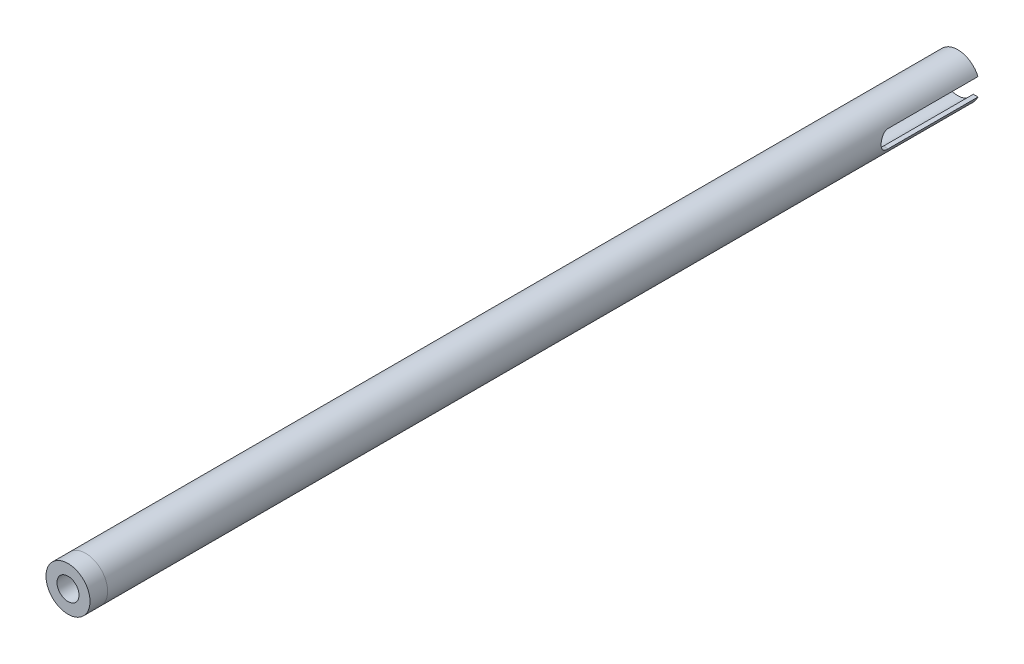
ISO-10303-21;
HEADER;
FILE_DESCRIPTION(('STEP AP214'),'2;1');
FILE_NAME('part.step','',(''),(''),'','','');
FILE_SCHEMA(('AUTOMOTIVE_DESIGN { 1 0 10303 214 1 1 1 1 }'));
ENDSEC;
DATA;
#1=APPLICATION_CONTEXT('core data for automotive mechanical design processes');
#2=APPLICATION_PROTOCOL_DEFINITION('international standard','automotive_design',2000,#1);
#3=PRODUCT_CONTEXT('',#1,'mechanical');
#4=PRODUCT('Part','Part','',(#3));
#5=PRODUCT_RELATED_PRODUCT_CATEGORY('part','',(#4));
#6=PRODUCT_DEFINITION_FORMATION('','',#4);
#7=PRODUCT_DEFINITION_CONTEXT('part definition',#1,'design');
#8=PRODUCT_DEFINITION('design','',#6,#7);
#9=PRODUCT_DEFINITION_SHAPE('','',#8);
#10=(LENGTH_UNIT() NAMED_UNIT(*) SI_UNIT(.MILLI.,.METRE.));
#11=(NAMED_UNIT(*) PLANE_ANGLE_UNIT() SI_UNIT($,.RADIAN.));
#12=(NAMED_UNIT(*) SI_UNIT($,.STERADIAN.) SOLID_ANGLE_UNIT());
#13=UNCERTAINTY_MEASURE_WITH_UNIT(LENGTH_MEASURE(1.E-05),#10,'distance_accuracy_value','');
#14=(GEOMETRIC_REPRESENTATION_CONTEXT(3) GLOBAL_UNCERTAINTY_ASSIGNED_CONTEXT((#13)) GLOBAL_UNIT_ASSIGNED_CONTEXT((#10,
#11,#12)) REPRESENTATION_CONTEXT('',''));
#15=CARTESIAN_POINT('',(0.,0.,0.));
#16=DIRECTION('',(0.,0.,1.));
#17=DIRECTION('',(1.,0.,0.));
#18=AXIS2_PLACEMENT_3D('',#15,#16,#17);
#19=CARTESIAN_POINT('',(0.,0.,-320.609127033779));
#20=DIRECTION('',(0.,0.,1.));
#21=DIRECTION('',(1.,0.,0.));
#22=AXIS2_PLACEMENT_3D('',#19,#20,#21);
#23=CYLINDRICAL_SURFACE('',#22,7.9375);
#24=CARTESIAN_POINT('',(0.,0.,-6.35));
#25=DIRECTION('',(0.,0.,1.));
#26=DIRECTION('',(1.,0.,0.));
#27=AXIS2_PLACEMENT_3D('',#24,#25,#26);
#28=CIRCLE('',#27,7.9375);
#29=CARTESIAN_POINT('',(7.9375,0.,-6.35));
#30=VERTEX_POINT('',#29);
#31=EDGE_CURVE('E167',#30,#30,#28,.T.);
#32=ORIENTED_EDGE('',*,*,#31,.F.);
#33=EDGE_LOOP('',(#32));
#34=FACE_BOUND('',#33,.T.);
#35=CARTESIAN_POINT('',(-7.2748389157424,3.175,-288.224127033779));
#36=CARTESIAN_POINT('',(-7.27482137043434,3.17501267173453,-288.138706918296));
#37=CARTESIAN_POINT('',(-7.27634297592672,3.17155313247793,-288.053296388733));
#38=CARTESIAN_POINT('',(-7.28233338484875,3.15778866907725,-287.883164384405));
#39=CARTESIAN_POINT('',(-7.28680106535325,3.14748635311323,-287.798442659546));
#40=CARTESIAN_POINT('',(-7.2985291631267,3.12019002880163,-287.630628959738));
#41=CARTESIAN_POINT('',(-7.30577831906487,3.10322299732752,-287.547531814978));
#42=CARTESIAN_POINT('',(-7.32282161153744,3.06278779397035,-287.383220712953));
#43=CARTESIAN_POINT('',(-7.33261590324725,3.03931922568674,-287.30200687084));
#44=CARTESIAN_POINT('',(-7.36535331460444,2.95952924342962,-287.062182048257));
#45=CARTESIAN_POINT('',(-7.39167595677839,2.89376893609239,-286.907057119453));
#46=CARTESIAN_POINT('',(-7.45033259991547,2.73920602658923,-286.609969692742));
#47=CARTESIAN_POINT('',(-7.48267254395243,2.65038060922872,-286.468020417524));
#48=CARTESIAN_POINT('',(-7.55175295441387,2.44684429809694,-286.193299648004));
#49=CARTESIAN_POINT('',(-7.58863404630155,2.33103943595687,-286.061372263493));
#50=CARTESIAN_POINT('',(-7.66147718953598,2.07914562663533,-285.818209379861));
#51=CARTESIAN_POINT('',(-7.69743902899202,1.94305205135846,-285.706978614933));
#52=CARTESIAN_POINT('',(-7.76611692840651,1.6477828266442,-285.504057415438));
#53=CARTESIAN_POINT('',(-7.79864638434712,1.48790317306358,-285.413323004034));
#54=CARTESIAN_POINT('',(-7.85502980346525,1.15369615984566,-285.260465450617));
#55=CARTESIAN_POINT('',(-7.87889360585224,0.97938546360275,-285.198309837999));
#56=CARTESIAN_POINT('',(-7.91022225039827,0.670405323433378,-285.117798194343));
#57=CARTESIAN_POINT('',(-7.92038443902171,0.537888188660459,-285.092120270933));
#58=CARTESIAN_POINT('',(-7.93061686811602,0.337231082382121,-285.066365187852));
#59=CARTESIAN_POINT('',(-7.93319257341971,0.26999164718031,-285.059907090571));
#60=CARTESIAN_POINT('',(-7.93663621925193,0.135173873369604,-285.05128607282));
#61=CARTESIAN_POINT('',(-7.93750363389236,0.0675954368175925,-285.049124475001));
#62=CARTESIAN_POINT('',(-7.9375,0.,-285.049127033779));
#63=B_SPLINE_CURVE_WITH_KNOTS('',3,(#35,#36,#37,#38,#39,#40,#41,#42,#43,#44,#45,#46,#47,#48,#49,
#50,#51,#52,#53,#54,#55,#56,#57,#58,#59,#60,#61,#62),.UNSPECIFIED.,.F.,.F.,(4,2,2,2,2,2,2,2,2,2,
2,2,2,4),(0.,0.256160797396612,0.512224013007058,0.767261264672238,1.02231406945471,
1.53142416248594,2.04103978047897,2.57679273649405,3.11266809162683,3.6699113602974,
4.22651992730642,4.63134321412665,4.83399375866619,5.03670667834028),.UNSPECIFIED.);
#64=CARTESIAN_POINT('',(-7.2748389157424,3.175,-288.224127033779));
#65=VERTEX_POINT('',#64);
#66=CARTESIAN_POINT('',(-7.9375,0.,-285.049127033779));
#67=VERTEX_POINT('',#66);
#68=EDGE_CURVE('E194',#65,#67,#63,.T.);
#69=ORIENTED_EDGE('',*,*,#68,.T.);
#70=CARTESIAN_POINT('',(-7.9375,0.,-285.049127033779));
#71=CARTESIAN_POINT('',(-7.93751279435796,-0.0856973243893185,-285.049115003609));
#72=CARTESIAN_POINT('',(-7.93611246860092,-0.171386675169292,-285.052596371082));
#73=CARTESIAN_POINT('',(-7.93058107051394,-0.342092796869088,-285.066452466416));
#74=CARTESIAN_POINT('',(-7.92645080745519,-0.427109759557718,-285.076825151399));
#75=CARTESIAN_POINT('',(-7.91557399086504,-0.59557069094832,-285.104322345467));
#76=CARTESIAN_POINT('',(-7.90883664469869,-0.679019123580011,-285.12142309674));
#77=CARTESIAN_POINT('',(-7.89293284658536,-0.844038966454646,-285.162190344213));
#78=CARTESIAN_POINT('',(-7.88376629739099,-0.925610301410304,-285.18585710327));
#79=CARTESIAN_POINT('',(-7.85297007832481,-1.16656173687588,-285.266364758968));
#80=CARTESIAN_POINT('',(-7.82802544143958,-1.32244720282989,-285.332757391846));
#81=CARTESIAN_POINT('',(-7.77174407779742,-1.62081902572888,-285.488802795839));
#82=CARTESIAN_POINT('',(-7.74040257287306,-1.7632952496653,-285.578472967902));
#83=CARTESIAN_POINT('',(-7.67287736621953,-2.03755465224644,-285.782926575417));
#84=CARTESIAN_POINT('',(-7.63654472176443,-2.16862853615059,-285.898613432148));
#85=CARTESIAN_POINT('',(-7.56380976030912,-2.4101102261282,-286.149907533858));
#86=CARTESIAN_POINT('',(-7.52740741976911,-2.52050895891189,-286.28552347834));
#87=CARTESIAN_POINT('',(-7.45683282624283,-2.72240939900243,-286.580221973206));
#88=CARTESIAN_POINT('',(-7.4228346735038,-2.81283701743189,-286.740085963122));
#89=CARTESIAN_POINT('',(-7.3633362219632,-2.96511894168387,-287.074211927918));
#90=CARTESIAN_POINT('',(-7.33782422493328,-3.02701262758154,-287.248453665677));
#91=CARTESIAN_POINT('',(-7.30424985403508,-3.10695047193342,-287.556757390328));
#92=CARTESIAN_POINT('',(-7.29331360019113,-3.13238569878909,-287.688616151214));
#93=CARTESIAN_POINT('',(-7.28227977674291,-3.15790858319001,-287.888333032908));
#94=CARTESIAN_POINT('',(-7.27949685702346,-3.16431127275807,-287.955281323668));
#95=CARTESIAN_POINT('',(-7.27577355567174,-3.17285909036155,-288.089522881534));
#96=CARTESIAN_POINT('',(-7.27483380475762,-3.1750027609968,-288.156816258832));
#97=CARTESIAN_POINT('',(-7.2748389157424,-3.175,-288.224127033779));
#98=B_SPLINE_CURVE_WITH_KNOTS('',3,(#70,#71,#72,#73,#74,#75,#76,#77,#78,#79,#80,#81,#82,#83,#84,
#85,#86,#87,#88,#89,#90,#91,#92,#93,#94,#95,#96,#97),.UNSPECIFIED.,.F.,.F.,(4,2,2,2,2,2,2,2,2,2,
2,2,2,4),(0.,0.256996432008007,0.513916713336979,0.769937797705388,1.02596913282157,
1.53722547809954,2.04886511530059,2.58219314099272,3.115754672018,3.67332953074262,
4.2301325519037,4.63306130520182,4.83485003827446,5.03670780985613),.UNSPECIFIED.);
#99=CARTESIAN_POINT('',(-7.2748389157424,-3.175,-288.224127033779));
#100=VERTEX_POINT('',#99);
#101=EDGE_CURVE('E146',#67,#100,#98,.T.);
#102=ORIENTED_EDGE('',*,*,#101,.T.);
#103=DIRECTION('',(0.,0.,-1.));
#104=VECTOR('',#103,1.);
#105=CARTESIAN_POINT('',(-7.2748389157424,-3.175,-285.049127033779));
#106=LINE('',#105,#104);
#107=CARTESIAN_POINT('',(-7.2748389157424,-3.175,-320.609127033779));
#108=VERTEX_POINT('',#107);
#109=EDGE_CURVE('E141',#100,#108,#106,.T.);
#110=ORIENTED_EDGE('',*,*,#109,.T.);
#111=CARTESIAN_POINT('',(0.,0.,-320.609127033779));
#112=DIRECTION('',(0.,0.,1.));
#113=DIRECTION('',(1.,0.,0.));
#114=AXIS2_PLACEMENT_3D('',#111,#112,#113);
#115=CIRCLE('',#114,7.9375);
#116=CARTESIAN_POINT('',(7.2748389157424,-3.175,-320.609127033779));
#117=VERTEX_POINT('',#116);
#118=EDGE_CURVE('E144',#108,#117,#115,.T.);
#119=ORIENTED_EDGE('',*,*,#118,.T.);
#120=DIRECTION('',(0.,0.,-1.));
#121=VECTOR('',#120,1.);
#122=CARTESIAN_POINT('',(7.2748389157424,-3.175,-285.049127033779));
#123=LINE('',#122,#121);
#124=CARTESIAN_POINT('',(7.2748389157424,-3.175,-288.224127033779));
#125=VERTEX_POINT('',#124);
#126=EDGE_CURVE('E427',#125,#117,#123,.T.);
#127=ORIENTED_EDGE('',*,*,#126,.F.);
#128=CARTESIAN_POINT('',(7.2748389157424,-3.175,-288.224127033779));
#129=CARTESIAN_POINT('',(7.27482137043434,-3.17501267173453,-288.138706918296));
#130=CARTESIAN_POINT('',(7.27634297592672,-3.17155313247793,-288.053296388733));
#131=CARTESIAN_POINT('',(7.28233338484875,-3.15778866907725,-287.883164384405));
#132=CARTESIAN_POINT('',(7.28680106535325,-3.14748635311323,-287.798442659546));
#133=CARTESIAN_POINT('',(7.2985291631267,-3.12019002880163,-287.630628959738));
#134=CARTESIAN_POINT('',(7.30577831906487,-3.10322299732752,-287.547531814978));
#135=CARTESIAN_POINT('',(7.32282161153744,-3.06278779397035,-287.383220712953));
#136=CARTESIAN_POINT('',(7.33261590324725,-3.03931922568674,-287.30200687084));
#137=CARTESIAN_POINT('',(7.36535331460444,-2.95952924342962,-287.062182048257));
#138=CARTESIAN_POINT('',(7.39167595677839,-2.89376893609239,-286.907057119453));
#139=CARTESIAN_POINT('',(7.45033259991547,-2.73920602658923,-286.609969692742));
#140=CARTESIAN_POINT('',(7.48267254395243,-2.65038060922872,-286.468020417524));
#141=CARTESIAN_POINT('',(7.55175295441387,-2.44684429809694,-286.193299648004));
#142=CARTESIAN_POINT('',(7.58863404630155,-2.33103943595687,-286.061372263493));
#143=CARTESIAN_POINT('',(7.66147718953598,-2.07914562663533,-285.818209379861));
#144=CARTESIAN_POINT('',(7.69743902899202,-1.94305205135846,-285.706978614933));
#145=CARTESIAN_POINT('',(7.76611692840651,-1.6477828266442,-285.504057415438));
#146=CARTESIAN_POINT('',(7.79864638434712,-1.48790317306358,-285.413323004034));
#147=CARTESIAN_POINT('',(7.85502980346525,-1.15369615984566,-285.260465450617));
#148=CARTESIAN_POINT('',(7.87889360585224,-0.97938546360275,-285.198309837999));
#149=CARTESIAN_POINT('',(7.91022225039827,-0.670405323433378,-285.117798194343));
#150=CARTESIAN_POINT('',(7.92038443902171,-0.537888188660459,-285.092120270933));
#151=CARTESIAN_POINT('',(7.93061686811602,-0.337231082382121,-285.066365187852));
#152=CARTESIAN_POINT('',(7.93319257341971,-0.26999164718031,-285.059907090571));
#153=CARTESIAN_POINT('',(7.93663621925193,-0.135173873369604,-285.05128607282));
#154=CARTESIAN_POINT('',(7.93750363389236,-0.0675954368175925,-285.049124475001));
#155=CARTESIAN_POINT('',(7.9375,0.,-285.049127033779));
#156=B_SPLINE_CURVE_WITH_KNOTS('',3,(#128,#129,#130,#131,#132,#133,#134,#135,#136,#137,#138,
#139,#140,#141,#142,#143,#144,#145,#146,#147,#148,#149,#150,#151,#152,#153,#154,#155),
.UNSPECIFIED.,.F.,.F.,(4,2,2,2,2,2,2,2,2,2,2,2,2,4),(0.,0.256160797396612,0.512224013007058,
0.767261264672238,1.02231406945471,1.53142416248594,2.04103978047897,2.57679273649405,
3.11266809162683,3.6699113602974,4.22651992730642,4.63134321412665,4.83399375866619,
5.03670667834028),.UNSPECIFIED.);
#157=CARTESIAN_POINT('',(7.9375,0.,-285.049127033779));
#158=VERTEX_POINT('',#157);
#159=EDGE_CURVE('E87',#125,#158,#156,.T.);
#160=ORIENTED_EDGE('',*,*,#159,.T.);
#161=CARTESIAN_POINT('',(7.9375,0.,-285.049127033779));
#162=CARTESIAN_POINT('',(7.93751279435796,0.0856973243893185,-285.049115003609));
#163=CARTESIAN_POINT('',(7.93611246860092,0.171386675169292,-285.052596371082));
#164=CARTESIAN_POINT('',(7.93058107051394,0.342092796869088,-285.066452466416));
#165=CARTESIAN_POINT('',(7.92645080745519,0.427109759557718,-285.076825151399));
#166=CARTESIAN_POINT('',(7.91557399086504,0.59557069094832,-285.104322345467));
#167=CARTESIAN_POINT('',(7.90883664469869,0.679019123580011,-285.12142309674));
#168=CARTESIAN_POINT('',(7.89293284658536,0.844038966454646,-285.162190344213));
#169=CARTESIAN_POINT('',(7.88376629739099,0.925610301410304,-285.18585710327));
#170=CARTESIAN_POINT('',(7.85297007832481,1.16656173687588,-285.266364758968));
#171=CARTESIAN_POINT('',(7.82802544143958,1.32244720282989,-285.332757391846));
#172=CARTESIAN_POINT('',(7.77174407779742,1.62081902572888,-285.488802795839));
#173=CARTESIAN_POINT('',(7.74040257287306,1.7632952496653,-285.578472967902));
#174=CARTESIAN_POINT('',(7.67287736621953,2.03755465224644,-285.782926575417));
#175=CARTESIAN_POINT('',(7.63654472176443,2.16862853615059,-285.898613432148));
#176=CARTESIAN_POINT('',(7.56380976030912,2.4101102261282,-286.149907533858));
#177=CARTESIAN_POINT('',(7.52740741976911,2.52050895891189,-286.28552347834));
#178=CARTESIAN_POINT('',(7.45683282624283,2.72240939900243,-286.580221973206));
#179=CARTESIAN_POINT('',(7.4228346735038,2.81283701743189,-286.740085963122));
#180=CARTESIAN_POINT('',(7.3633362219632,2.96511894168387,-287.074211927918));
#181=CARTESIAN_POINT('',(7.33782422493328,3.02701262758154,-287.248453665677));
#182=CARTESIAN_POINT('',(7.30424985403508,3.10695047193342,-287.556757390328));
#183=CARTESIAN_POINT('',(7.29331360019113,3.13238569878909,-287.688616151214));
#184=CARTESIAN_POINT('',(7.28227977674291,3.15790858319001,-287.888333032908));
#185=CARTESIAN_POINT('',(7.27949685702346,3.16431127275807,-287.955281323668));
#186=CARTESIAN_POINT('',(7.27577355567174,3.17285909036155,-288.089522881534));
#187=CARTESIAN_POINT('',(7.27483380475762,3.1750027609968,-288.156816258832));
#188=CARTESIAN_POINT('',(7.2748389157424,3.175,-288.224127033779));
#189=B_SPLINE_CURVE_WITH_KNOTS('',3,(#161,#162,#163,#164,#165,#166,#167,#168,#169,#170,#171,
#172,#173,#174,#175,#176,#177,#178,#179,#180,#181,#182,#183,#184,#185,#186,#187,#188),
.UNSPECIFIED.,.F.,.F.,(4,2,2,2,2,2,2,2,2,2,2,2,2,4),(0.,0.256996432008007,0.513916713336979,
0.769937797705388,1.02596913282157,1.53722547809954,2.04886511530059,2.58219314099272,
3.115754672018,3.67332953074262,4.2301325519037,4.63306130520182,4.83485003827446,
5.03670780985613),.UNSPECIFIED.);
#190=CARTESIAN_POINT('',(7.2748389157424,3.175,-288.224127033779));
#191=VERTEX_POINT('',#190);
#192=EDGE_CURVE('E73',#158,#191,#189,.T.);
#193=ORIENTED_EDGE('',*,*,#192,.T.);
#194=DIRECTION('',(0.,0.,-1.));
#195=VECTOR('',#194,1.);
#196=CARTESIAN_POINT('',(7.2748389157424,3.175,-285.049127033779));
#197=LINE('',#196,#195);
#198=CARTESIAN_POINT('',(7.2748389157424,3.175,-320.609127033779));
#199=VERTEX_POINT('',#198);
#200=EDGE_CURVE('E160',#191,#199,#197,.T.);
#201=ORIENTED_EDGE('',*,*,#200,.T.);
#202=CARTESIAN_POINT('',(-7.2748389157424,3.175,-320.609127033779));
#203=VERTEX_POINT('',#202);
#204=EDGE_CURVE('E166',#199,#203,#115,.T.);
#205=ORIENTED_EDGE('',*,*,#204,.T.);
#206=DIRECTION('',(0.,0.,-1.));
#207=VECTOR('',#206,1.);
#208=CARTESIAN_POINT('',(-7.2748389157424,3.175,-285.049127033779));
#209=LINE('',#208,#207);
#210=EDGE_CURVE('E420',#65,#203,#209,.T.);
#211=ORIENTED_EDGE('',*,*,#210,.F.);
#212=EDGE_LOOP('',(#69,#102,#110,#119,#127,#160,#193,#201,#205,#211));
#213=FACE_BOUND('',#212,.T.);
#214=ADVANCED_FACE('F63',(#34,#213),#23,.T.);
#215=CARTESIAN_POINT('',(0.,0.,-320.609127033779));
#216=DIRECTION('',(0.,0.,1.));
#217=DIRECTION('',(1.,0.,0.));
#218=AXIS2_PLACEMENT_3D('',#215,#216,#217);
#219=PLANE('',#218);
#220=DIRECTION('',(1.,0.,0.));
#221=VECTOR('',#220,1.);
#222=CARTESIAN_POINT('',(0.,-3.175,-320.609127033779));
#223=LINE('',#222,#221);
#224=CARTESIAN_POINT('',(-5.57246419907746,-3.175,-320.609127033779));
#225=VERTEX_POINT('',#224);
#226=EDGE_CURVE('E153',#108,#225,#223,.T.);
#227=ORIENTED_EDGE('',*,*,#226,.T.);
#228=CARTESIAN_POINT('',(0.,0.,-320.609127033779));
#229=DIRECTION('',(0.,0.,1.));
#230=DIRECTION('',(1.,0.,0.));
#231=AXIS2_PLACEMENT_3D('',#228,#229,#230);
#232=CIRCLE('',#231,6.4135);
#233=CARTESIAN_POINT('',(5.57246419907746,-3.175,-320.609127033779));
#234=VERTEX_POINT('',#233);
#235=EDGE_CURVE('E275',#225,#234,#232,.T.);
#236=ORIENTED_EDGE('',*,*,#235,.T.);
#237=DIRECTION('',(1.,0.,0.));
#238=VECTOR('',#237,1.);
#239=CARTESIAN_POINT('',(0.,-3.175,-320.609127033779));
#240=LINE('',#239,#238);
#241=EDGE_CURVE('E165',#234,#117,#240,.T.);
#242=ORIENTED_EDGE('',*,*,#241,.T.);
#243=ORIENTED_EDGE('',*,*,#118,.F.);
#244=EDGE_LOOP('',(#227,#236,#242,#243));
#245=FACE_BOUND('',#244,.T.);
#246=ADVANCED_FACE('F163',(#245),#219,.F.);
#247=CARTESIAN_POINT('',(0.,0.,-320.609127033779));
#248=DIRECTION('',(0.,0.,1.));
#249=DIRECTION('',(1.,0.,0.));
#250=AXIS2_PLACEMENT_3D('',#247,#248,#249);
#251=CYLINDRICAL_SURFACE('',#250,6.4135);
#252=CARTESIAN_POINT('',(0.,0.,-6.35));
#253=DIRECTION('',(0.,0.,1.));
#254=DIRECTION('',(1.,0.,0.));
#255=AXIS2_PLACEMENT_3D('',#252,#253,#254);
#256=CIRCLE('',#255,6.4135);
#257=CARTESIAN_POINT('',(6.4135,0.,-6.35));
#258=VERTEX_POINT('',#257);
#259=EDGE_CURVE('E149',#258,#258,#256,.T.);
#260=ORIENTED_EDGE('',*,*,#259,.T.);
#261=EDGE_LOOP('',(#260));
#262=FACE_BOUND('',#261,.T.);
#263=DIRECTION('',(0.,0.,-1.));
#264=VECTOR('',#263,1.);
#265=CARTESIAN_POINT('',(-5.57246419907746,-3.175,-285.049127033779));
#266=LINE('',#265,#264);
#267=CARTESIAN_POINT('',(-5.57246419907746,-3.175,-288.224127033779));
#268=VERTEX_POINT('',#267);
#269=EDGE_CURVE('E150',#268,#225,#266,.T.);
#270=ORIENTED_EDGE('',*,*,#269,.F.);
#271=CARTESIAN_POINT('',(-5.57246419907746,-3.175,-288.224127033779));
#272=CARTESIAN_POINT('',(-5.57244013006406,-3.17501485930532,-288.14084792074));
#273=CARTESIAN_POINT('',(-5.57433046393328,-3.17172393593588,-288.057582153869));
#274=CARTESIAN_POINT('',(-5.58175879139227,-3.15864741746939,-287.891774569058));
#275=CARTESIAN_POINT('',(-5.58729459414878,-3.14886572313217,-287.809232346457));
#276=CARTESIAN_POINT('',(-5.60179156831921,-3.12299843383606,-287.645935539727));
#277=CARTESIAN_POINT('',(-5.61073298145,-3.10694918790096,-287.565173434814));
#278=CARTESIAN_POINT('',(-5.63171276239417,-3.06875665913499,-287.405529519313));
#279=CARTESIAN_POINT('',(-5.64375147558632,-3.04661269666535,-287.326647919493));
#280=CARTESIAN_POINT('',(-5.6838799338154,-2.97148657354666,-287.093914744494));
#281=CARTESIAN_POINT('',(-5.71602843451584,-2.90973243042152,-286.943494247255));
#282=CARTESIAN_POINT('',(-5.78746445334561,-2.76491119647661,-286.655037030427));
#283=CARTESIAN_POINT('',(-5.8267630725243,-2.68181088046089,-286.517020073061));
#284=CARTESIAN_POINT('',(-5.91189137020973,-2.4888741873712,-286.245222989033));
#285=CARTESIAN_POINT('',(-5.95799203211625,-2.3774302216902,-286.112666186582));
#286=CARTESIAN_POINT('',(-6.04933625068997,-2.13433179626953,-285.867198517509));
#287=CARTESIAN_POINT('',(-6.09457954365871,-2.00267122837299,-285.754293610496));
#288=CARTESIAN_POINT('',(-6.18270630442022,-1.71220053093684,-285.543974318044));
#289=CARTESIAN_POINT('',(-6.22523407848511,-1.55216870534977,-285.448084567613));
#290=CARTESIAN_POINT('',(-6.29953728626817,-1.21586879246634,-285.285235671295));
#291=CARTESIAN_POINT('',(-6.33132906884323,-1.03962591706378,-285.218232493253));
#292=CARTESIAN_POINT('',(-6.37455801221378,-0.719418942476262,-285.128360660922));
#293=CARTESIAN_POINT('',(-6.38903678436651,-0.577736145507969,-285.098787946558));
#294=CARTESIAN_POINT('',(-6.40364692368403,-0.362616983152046,-285.069066872243));
#295=CARTESIAN_POINT('',(-6.40733246196224,-0.290370591494084,-285.061599359606));
#296=CARTESIAN_POINT('',(-6.41226237468065,-0.145424356491909,-285.051626470668));
#297=CARTESIAN_POINT('',(-6.41350576158006,-0.0727243416303731,-285.04912310173));
#298=CARTESIAN_POINT('',(-6.4135,0.,-285.049127033779));
#299=B_SPLINE_CURVE_WITH_KNOTS('',3,(#271,#272,#273,#274,#275,#276,#277,#278,#279,#280,#281,
#282,#283,#284,#285,#286,#287,#288,#289,#290,#291,#292,#293,#294,#295,#296,#297,#298),
.UNSPECIFIED.,.F.,.F.,(4,2,2,2,2,2,2,2,2,2,2,2,2,4),(0.,0.249729002226608,0.499308060527526,
0.747460667546715,0.995640957972498,1.49055300136654,1.98624009021394,2.5216022790879,
3.05712653941517,3.62817923327588,4.198358360085,4.63305000595097,4.85103401853338,
5.06910615989468),.UNSPECIFIED.);
#300=CARTESIAN_POINT('',(-6.4135,0.,-285.049127033779));
#301=VERTEX_POINT('',#300);
#302=EDGE_CURVE('E221',#268,#301,#299,.T.);
#303=ORIENTED_EDGE('',*,*,#302,.T.);
#304=CARTESIAN_POINT('',(-6.4135,0.,-285.049127033779));
#305=CARTESIAN_POINT('',(-6.41351478956105,0.0839162873638196,-285.049113633882));
#306=CARTESIAN_POINT('',(-6.41185341043851,0.167823114288182,-285.05245355993));
#307=CARTESIAN_POINT('',(-6.40528923860734,0.33495253632637,-285.065736000534));
#308=CARTESIAN_POINT('',(-6.40038773102953,0.418175389480092,-285.075675897355));
#309=CARTESIAN_POINT('',(-6.38748331817869,0.58296549878522,-285.101994701873));
#310=CARTESIAN_POINT('',(-6.37949454331383,0.664538541389253,-285.118344277361));
#311=CARTESIAN_POINT('',(-6.36062930478242,0.825821595252368,-285.157282580955));
#312=CARTESIAN_POINT('',(-6.34975266552956,0.905531492908811,-285.179871688436));
#313=CARTESIAN_POINT('',(-6.31319792977548,1.14087800407252,-285.256608251195));
#314=CARTESIAN_POINT('',(-6.28356695572383,1.29306927815055,-285.319779899384));
#315=CARTESIAN_POINT('',(-6.21648032622801,1.58455945770353,-285.467930641363));
#316=CARTESIAN_POINT('',(-6.17901685649499,1.72384528592309,-285.552931533143));
#317=CARTESIAN_POINT('',(-6.09713913910647,1.99475482128856,-285.748031671394));
#318=CARTESIAN_POINT('',(-6.05244508581476,2.12544046453043,-285.859316548133));
#319=CARTESIAN_POINT('',(-5.96206469267669,2.36716277188881,-286.101285994298));
#320=CARTESIAN_POINT('',(-5.9163776032387,2.47818397002904,-286.231985686137));
#321=CARTESIAN_POINT('',(-5.82517699615972,2.68591268931947,-286.521031515089));
#322=CARTESIAN_POINT('',(-5.77994318763785,2.78087960507694,-286.68072670967));
#323=CARTESIAN_POINT('',(-5.69959190124919,2.9420744279085,-287.016109986851));
#324=CARTESIAN_POINT('',(-5.66445328320705,3.00836254036259,-287.191763620023));
#325=CARTESIAN_POINT('',(-5.61637168534323,3.09697219420915,-287.510214994417));
#326=CARTESIAN_POINT('',(-5.60011055849822,3.1260622343607,-287.650629597076));
#327=CARTESIAN_POINT('',(-5.58363385282995,3.15533369889112,-287.864006475319));
#328=CARTESIAN_POINT('',(-5.57946041232981,3.16269716900745,-287.935738200201));
#329=CARTESIAN_POINT('',(-5.57386984218861,3.17253394278506,-288.079680140243));
#330=CARTESIAN_POINT('',(-5.57245416126573,3.17500467618403,-288.151890586914));
#331=CARTESIAN_POINT('',(-5.57246419907746,3.175,-288.224127033779));
#332=B_SPLINE_CURVE_WITH_KNOTS('',3,(#304,#305,#306,#307,#308,#309,#310,#311,#312,#313,#314,
#315,#316,#317,#318,#319,#320,#321,#322,#323,#324,#325,#326,#327,#328,#329,#330,#331),
.UNSPECIFIED.,.F.,.F.,(4,2,2,2,2,2,2,2,2,2,2,2,2,4),(0.,0.251650249697328,0.503200747298847,
0.75361328099314,1.00404104361821,1.50387930503274,2.00421864304453,2.53410176460237,
3.06439980342596,3.63519589642624,4.20478783377489,4.63602373673194,4.85251353275904,
5.06911702550462),.UNSPECIFIED.);
#333=CARTESIAN_POINT('',(-5.57246419907746,3.175,-288.224127033779));
#334=VERTEX_POINT('',#333);
#335=EDGE_CURVE('E186',#301,#334,#332,.T.);
#336=ORIENTED_EDGE('',*,*,#335,.T.);
#337=DIRECTION('',(0.,0.,-1.));
#338=VECTOR('',#337,1.);
#339=CARTESIAN_POINT('',(-5.57246419907746,3.175,-285.049127033779));
#340=LINE('',#339,#338);
#341=CARTESIAN_POINT('',(-5.57246419907746,3.175,-320.609127033779));
#342=VERTEX_POINT('',#341);
#343=EDGE_CURVE('E417',#334,#342,#340,.T.);
#344=ORIENTED_EDGE('',*,*,#343,.T.);
#345=CARTESIAN_POINT('',(5.57246419907746,3.175,-320.609127033779));
#346=VERTEX_POINT('',#345);
#347=EDGE_CURVE('E172',#346,#342,#232,.T.);
#348=ORIENTED_EDGE('',*,*,#347,.F.);
#349=DIRECTION('',(0.,0.,-1.));
#350=VECTOR('',#349,1.);
#351=CARTESIAN_POINT('',(5.57246419907746,3.175,-285.049127033779));
#352=LINE('',#351,#350);
#353=CARTESIAN_POINT('',(5.57246419907746,3.175,-288.224127033779));
#354=VERTEX_POINT('',#353);
#355=EDGE_CURVE('E269',#354,#346,#352,.T.);
#356=ORIENTED_EDGE('',*,*,#355,.F.);
#357=CARTESIAN_POINT('',(5.57246419907746,3.175,-288.224127033779));
#358=CARTESIAN_POINT('',(5.57244013006406,3.17501485930532,-288.14084792074));
#359=CARTESIAN_POINT('',(5.57433046393328,3.17172393593588,-288.057582153869));
#360=CARTESIAN_POINT('',(5.58175879139227,3.15864741746939,-287.891774569058));
#361=CARTESIAN_POINT('',(5.58729459414878,3.14886572313217,-287.809232346457));
#362=CARTESIAN_POINT('',(5.60179156831921,3.12299843383606,-287.645935539727));
#363=CARTESIAN_POINT('',(5.61073298145,3.10694918790096,-287.565173434814));
#364=CARTESIAN_POINT('',(5.63171276239417,3.06875665913499,-287.405529519313));
#365=CARTESIAN_POINT('',(5.64375147558632,3.04661269666535,-287.326647919493));
#366=CARTESIAN_POINT('',(5.6838799338154,2.97148657354666,-287.093914744494));
#367=CARTESIAN_POINT('',(5.71602843451584,2.90973243042152,-286.943494247255));
#368=CARTESIAN_POINT('',(5.78746445334561,2.76491119647661,-286.655037030427));
#369=CARTESIAN_POINT('',(5.8267630725243,2.68181088046089,-286.517020073061));
#370=CARTESIAN_POINT('',(5.91189137020973,2.4888741873712,-286.245222989033));
#371=CARTESIAN_POINT('',(5.95799203211625,2.3774302216902,-286.112666186582));
#372=CARTESIAN_POINT('',(6.04933625068997,2.13433179626953,-285.867198517509));
#373=CARTESIAN_POINT('',(6.09457954365871,2.00267122837299,-285.754293610496));
#374=CARTESIAN_POINT('',(6.18270630442022,1.71220053093684,-285.543974318044));
#375=CARTESIAN_POINT('',(6.22523407848511,1.55216870534977,-285.448084567613));
#376=CARTESIAN_POINT('',(6.29953728626817,1.21586879246634,-285.285235671295));
#377=CARTESIAN_POINT('',(6.33132906884323,1.03962591706378,-285.218232493253));
#378=CARTESIAN_POINT('',(6.37455801221378,0.719418942476262,-285.128360660922));
#379=CARTESIAN_POINT('',(6.38903678436651,0.577736145507969,-285.098787946558));
#380=CARTESIAN_POINT('',(6.40364692368403,0.362616983152046,-285.069066872243));
#381=CARTESIAN_POINT('',(6.40733246196224,0.290370591494084,-285.061599359606));
#382=CARTESIAN_POINT('',(6.41226237468065,0.145424356491909,-285.051626470668));
#383=CARTESIAN_POINT('',(6.41350576158006,0.0727243416303731,-285.04912310173));
#384=CARTESIAN_POINT('',(6.4135,0.,-285.049127033779));
#385=B_SPLINE_CURVE_WITH_KNOTS('',3,(#357,#358,#359,#360,#361,#362,#363,#364,#365,#366,#367,
#368,#369,#370,#371,#372,#373,#374,#375,#376,#377,#378,#379,#380,#381,#382,#383,#384),
.UNSPECIFIED.,.F.,.F.,(4,2,2,2,2,2,2,2,2,2,2,2,2,4),(0.,0.249729002226608,0.499308060527526,
0.747460667546715,0.995640957972498,1.49055300136654,1.98624009021394,2.5216022790879,
3.05712653941517,3.62817923327588,4.198358360085,4.63305000595097,4.85103401853338,
5.06910615989468),.UNSPECIFIED.);
#386=CARTESIAN_POINT('',(6.4135,0.,-285.049127033779));
#387=VERTEX_POINT('',#386);
#388=EDGE_CURVE('E13',#354,#387,#385,.T.);
#389=ORIENTED_EDGE('',*,*,#388,.T.);
#390=CARTESIAN_POINT('',(6.4135,0.,-285.049127033779));
#391=CARTESIAN_POINT('',(6.41351478956105,-0.0839162873638196,-285.049113633882));
#392=CARTESIAN_POINT('',(6.41185341043851,-0.167823114288182,-285.05245355993));
#393=CARTESIAN_POINT('',(6.40528923860734,-0.33495253632637,-285.065736000534));
#394=CARTESIAN_POINT('',(6.40038773102953,-0.418175389480092,-285.075675897355));
#395=CARTESIAN_POINT('',(6.38748331817869,-0.58296549878522,-285.101994701873));
#396=CARTESIAN_POINT('',(6.37949454331383,-0.664538541389253,-285.118344277361));
#397=CARTESIAN_POINT('',(6.36062930478242,-0.825821595252368,-285.157282580955));
#398=CARTESIAN_POINT('',(6.34975266552956,-0.905531492908811,-285.179871688436));
#399=CARTESIAN_POINT('',(6.31319792977548,-1.14087800407252,-285.256608251195));
#400=CARTESIAN_POINT('',(6.28356695572383,-1.29306927815055,-285.319779899384));
#401=CARTESIAN_POINT('',(6.21648032622801,-1.58455945770353,-285.467930641363));
#402=CARTESIAN_POINT('',(6.17901685649499,-1.72384528592309,-285.552931533143));
#403=CARTESIAN_POINT('',(6.09713913910647,-1.99475482128856,-285.748031671394));
#404=CARTESIAN_POINT('',(6.05244508581476,-2.12544046453043,-285.859316548133));
#405=CARTESIAN_POINT('',(5.96206469267669,-2.36716277188881,-286.101285994298));
#406=CARTESIAN_POINT('',(5.9163776032387,-2.47818397002904,-286.231985686137));
#407=CARTESIAN_POINT('',(5.82517699615972,-2.68591268931947,-286.521031515089));
#408=CARTESIAN_POINT('',(5.77994318763785,-2.78087960507694,-286.68072670967));
#409=CARTESIAN_POINT('',(5.69959190124919,-2.9420744279085,-287.016109986851));
#410=CARTESIAN_POINT('',(5.66445328320705,-3.00836254036259,-287.191763620023));
#411=CARTESIAN_POINT('',(5.61637168534323,-3.09697219420915,-287.510214994417));
#412=CARTESIAN_POINT('',(5.60011055849822,-3.1260622343607,-287.650629597076));
#413=CARTESIAN_POINT('',(5.58363385282995,-3.15533369889112,-287.864006475319));
#414=CARTESIAN_POINT('',(5.57946041232981,-3.16269716900745,-287.935738200201));
#415=CARTESIAN_POINT('',(5.57386984218861,-3.17253394278506,-288.079680140243));
#416=CARTESIAN_POINT('',(5.57245416126573,-3.17500467618403,-288.151890586914));
#417=CARTESIAN_POINT('',(5.57246419907746,-3.175,-288.224127033779));
#418=B_SPLINE_CURVE_WITH_KNOTS('',3,(#390,#391,#392,#393,#394,#395,#396,#397,#398,#399,#400,
#401,#402,#403,#404,#405,#406,#407,#408,#409,#410,#411,#412,#413,#414,#415,#416,#417),
.UNSPECIFIED.,.F.,.F.,(4,2,2,2,2,2,2,2,2,2,2,2,2,4),(0.,0.251650249697328,0.503200747298847,
0.75361328099314,1.00404104361821,1.50387930503274,2.00421864304453,2.53410176460237,
3.06439980342596,3.63519589642624,4.20478783377489,4.63602373673194,4.85251353275904,
5.06911702550462),.UNSPECIFIED.);
#419=CARTESIAN_POINT('',(5.57246419907746,-3.175,-288.224127033779));
#420=VERTEX_POINT('',#419);
#421=EDGE_CURVE('E237',#387,#420,#418,.T.);
#422=ORIENTED_EDGE('',*,*,#421,.T.);
#423=DIRECTION('',(0.,0.,-1.));
#424=VECTOR('',#423,1.);
#425=CARTESIAN_POINT('',(5.57246419907746,-3.175,-285.049127033779));
#426=LINE('',#425,#424);
#427=EDGE_CURVE('E271',#420,#234,#426,.T.);
#428=ORIENTED_EDGE('',*,*,#427,.T.);
#429=ORIENTED_EDGE('',*,*,#235,.F.);
#430=EDGE_LOOP('',(#270,#303,#336,#344,#348,#356,#389,#422,#428,#429));
#431=FACE_BOUND('',#430,.T.);
#432=ADVANCED_FACE('F201',(#262,#431),#251,.F.);
#433=ORIENTED_EDGE('',*,*,#347,.T.);
#434=DIRECTION('',(1.,0.,0.));
#435=VECTOR('',#434,1.);
#436=CARTESIAN_POINT('',(0.,3.175,-320.609127033779));
#437=LINE('',#436,#435);
#438=EDGE_CURVE('E159',#203,#342,#437,.T.);
#439=ORIENTED_EDGE('',*,*,#438,.F.);
#440=ORIENTED_EDGE('',*,*,#204,.F.);
#441=DIRECTION('',(1.,0.,0.));
#442=VECTOR('',#441,1.);
#443=CARTESIAN_POINT('',(0.,3.175,-320.609127033779));
#444=LINE('',#443,#442);
#445=EDGE_CURVE('E253',#346,#199,#444,.T.);
#446=ORIENTED_EDGE('',*,*,#445,.F.);
#447=EDGE_LOOP('',(#433,#439,#440,#446));
#448=FACE_BOUND('',#447,.T.);
#449=ADVANCED_FACE('F286',(#448),#219,.F.);
#450=CARTESIAN_POINT('',(0.,0.,-6.35));
#451=DIRECTION('',(0.,0.,1.));
#452=DIRECTION('',(1.,0.,0.));
#453=AXIS2_PLACEMENT_3D('',#450,#451,#452);
#454=PLANE('',#453);
#455=ORIENTED_EDGE('',*,*,#259,.F.);
#456=EDGE_LOOP('',(#455));
#457=FACE_BOUND('',#456,.T.);
#458=ORIENTED_EDGE('',*,*,#31,.T.);
#459=EDGE_LOOP('',(#458));
#460=FACE_BOUND('',#459,.T.);
#461=ADVANCED_FACE('F283',(#457,#460),#454,.T.);
#462=CARTESIAN_POINT('',(0.,3.175,-285.049127033779));
#463=DIRECTION('',(0.,1.,0.));
#464=DIRECTION('',(0.,0.,1.));
#465=AXIS2_PLACEMENT_3D('',#462,#463,#464);
#466=PLANE('',#465);
#467=ORIENTED_EDGE('',*,*,#200,.F.);
#468=DIRECTION('',(1.,0.,0.));
#469=VECTOR('',#468,1.);
#470=CARTESIAN_POINT('',(5.57246419907746,3.175,-288.224127033779));
#471=LINE('',#470,#469);
#472=EDGE_CURVE('E184',#191,#354,#471,.F.);
#473=ORIENTED_EDGE('',*,*,#472,.T.);
#474=ORIENTED_EDGE('',*,*,#355,.T.);
#475=ORIENTED_EDGE('',*,*,#445,.T.);
#476=EDGE_LOOP('',(#467,#473,#474,#475));
#477=FACE_BOUND('',#476,.T.);
#478=ADVANCED_FACE('F266',(#477),#466,.F.);
#479=CARTESIAN_POINT('',(0.,-3.175,-285.049127033779));
#480=DIRECTION('',(0.,1.,0.));
#481=DIRECTION('',(0.,0.,1.));
#482=AXIS2_PLACEMENT_3D('',#479,#480,#481);
#483=PLANE('',#482);
#484=ORIENTED_EDGE('',*,*,#427,.F.);
#485=DIRECTION('',(1.,0.,0.));
#486=VECTOR('',#485,1.);
#487=CARTESIAN_POINT('',(0.,-3.175,-288.224127033779));
#488=LINE('',#487,#486);
#489=EDGE_CURVE('E181',#420,#125,#488,.T.);
#490=ORIENTED_EDGE('',*,*,#489,.T.);
#491=ORIENTED_EDGE('',*,*,#126,.T.);
#492=ORIENTED_EDGE('',*,*,#241,.F.);
#493=EDGE_LOOP('',(#484,#490,#491,#492));
#494=FACE_BOUND('',#493,.T.);
#495=ADVANCED_FACE('F361',(#494),#483,.T.);
#496=CARTESIAN_POINT('',(0.,-3.175,-285.049127033779));
#497=DIRECTION('',(0.,1.,0.));
#498=DIRECTION('',(0.,0.,1.));
#499=AXIS2_PLACEMENT_3D('',#496,#497,#498);
#500=PLANE('',#499);
#501=ORIENTED_EDGE('',*,*,#109,.F.);
#502=DIRECTION('',(1.,0.,0.));
#503=VECTOR('',#502,1.);
#504=CARTESIAN_POINT('',(0.,-3.175,-288.224127033779));
#505=LINE('',#504,#503);
#506=EDGE_CURVE('E179',#100,#268,#505,.T.);
#507=ORIENTED_EDGE('',*,*,#506,.T.);
#508=ORIENTED_EDGE('',*,*,#269,.T.);
#509=ORIENTED_EDGE('',*,*,#226,.F.);
#510=EDGE_LOOP('',(#501,#507,#508,#509));
#511=FACE_BOUND('',#510,.T.);
#512=ADVANCED_FACE('F154',(#511),#500,.T.);
#513=CARTESIAN_POINT('',(0.,3.175,-285.049127033779));
#514=DIRECTION('',(0.,1.,0.));
#515=DIRECTION('',(0.,0.,1.));
#516=AXIS2_PLACEMENT_3D('',#513,#514,#515);
#517=PLANE('',#516);
#518=ORIENTED_EDGE('',*,*,#343,.F.);
#519=DIRECTION('',(1.,0.,0.));
#520=VECTOR('',#519,1.);
#521=CARTESIAN_POINT('',(-7.2748389157424,3.175,-288.224127033779));
#522=LINE('',#521,#520);
#523=EDGE_CURVE('E170',#334,#65,#522,.F.);
#524=ORIENTED_EDGE('',*,*,#523,.T.);
#525=ORIENTED_EDGE('',*,*,#210,.T.);
#526=ORIENTED_EDGE('',*,*,#438,.T.);
#527=EDGE_LOOP('',(#518,#524,#525,#526));
#528=FACE_BOUND('',#527,.T.);
#529=ADVANCED_FACE('F216',(#528),#517,.F.);
#530=CARTESIAN_POINT('',(0.,0.,-288.224127033779));
#531=DIRECTION('',(1.,0.,0.));
#532=DIRECTION('',(0.,0.,-1.));
#533=AXIS2_PLACEMENT_3D('',#530,#531,#532);
#534=CYLINDRICAL_SURFACE('',#533,3.175);
#535=ORIENTED_EDGE('',*,*,#506,.F.);
#536=ORIENTED_EDGE('',*,*,#101,.F.);
#537=DIRECTION('',(1.,0.,0.));
#538=VECTOR('',#537,1.);
#539=CARTESIAN_POINT('',(0.,0.,-285.049127033779));
#540=LINE('',#539,#538);
#541=EDGE_CURVE('E251',#301,#67,#540,.F.);
#542=ORIENTED_EDGE('',*,*,#541,.F.);
#543=ORIENTED_EDGE('',*,*,#302,.F.);
#544=EDGE_LOOP('',(#535,#536,#542,#543));
#545=FACE_BOUND('',#544,.T.);
#546=ADVANCED_FACE('F209',(#545),#534,.F.);
#547=CARTESIAN_POINT('',(0.,0.,-288.224127033779));
#548=DIRECTION('',(-1.,0.,0.));
#549=DIRECTION('',(0.,0.,1.));
#550=AXIS2_PLACEMENT_3D('',#547,#548,#549);
#551=CYLINDRICAL_SURFACE('',#550,3.175);
#552=ORIENTED_EDGE('',*,*,#68,.F.);
#553=ORIENTED_EDGE('',*,*,#523,.F.);
#554=ORIENTED_EDGE('',*,*,#335,.F.);
#555=ORIENTED_EDGE('',*,*,#541,.T.);
#556=EDGE_LOOP('',(#552,#553,#554,#555));
#557=FACE_BOUND('',#556,.T.);
#558=ADVANCED_FACE('F205',(#557),#551,.F.);
#559=CARTESIAN_POINT('',(0.,0.,-288.224127033779));
#560=DIRECTION('',(-1.,0.,0.));
#561=DIRECTION('',(0.,0.,1.));
#562=AXIS2_PLACEMENT_3D('',#559,#560,#561);
#563=CYLINDRICAL_SURFACE('',#562,3.175);
#564=DIRECTION('',(1.,0.,0.));
#565=VECTOR('',#564,1.);
#566=CARTESIAN_POINT('',(7.2748389157424,0.,-285.049127033779));
#567=LINE('',#566,#565);
#568=EDGE_CURVE('E68',#387,#158,#567,.T.);
#569=ORIENTED_EDGE('',*,*,#568,.F.);
#570=ORIENTED_EDGE('',*,*,#388,.F.);
#571=ORIENTED_EDGE('',*,*,#472,.F.);
#572=ORIENTED_EDGE('',*,*,#192,.F.);
#573=EDGE_LOOP('',(#569,#570,#571,#572));
#574=FACE_BOUND('',#573,.T.);
#575=ADVANCED_FACE('F65',(#574),#563,.F.);
#576=CARTESIAN_POINT('',(0.,0.,-288.224127033779));
#577=DIRECTION('',(1.,0.,0.));
#578=DIRECTION('',(0.,0.,-1.));
#579=AXIS2_PLACEMENT_3D('',#576,#577,#578);
#580=CYLINDRICAL_SURFACE('',#579,3.175);
#581=ORIENTED_EDGE('',*,*,#421,.F.);
#582=ORIENTED_EDGE('',*,*,#568,.T.);
#583=ORIENTED_EDGE('',*,*,#159,.F.);
#584=ORIENTED_EDGE('',*,*,#489,.F.);
#585=EDGE_LOOP('',(#581,#582,#583,#584));
#586=FACE_BOUND('',#585,.T.);
#587=ADVANCED_FACE('F218',(#586),#580,.F.);
#588=CLOSED_SHELL('',(#214,#246,#432,#449,#461,#478,#495,#512,#529,#546,#558,#575,#587));
#589=MANIFOLD_SOLID_BREP('B2',#588);
#590=CARTESIAN_POINT('',(0.,0.,-6.35));
#591=DIRECTION('',(0.,0.,1.));
#592=DIRECTION('',(1.,0.,0.));
#593=AXIS2_PLACEMENT_3D('',#590,#591,#592);
#594=CYLINDRICAL_SURFACE('',#593,7.9375);
#595=CARTESIAN_POINT('',(0.,0.,-6.35));
#596=DIRECTION('',(0.,0.,1.));
#597=DIRECTION('',(1.,0.,0.));
#598=AXIS2_PLACEMENT_3D('',#595,#596,#597);
#599=CIRCLE('',#598,7.9375);
#600=CARTESIAN_POINT('',(7.9375,0.,-6.35));
#601=VERTEX_POINT('',#600);
#602=EDGE_CURVE('E62',#601,#601,#599,.T.);
#603=ORIENTED_EDGE('',*,*,#602,.T.);
#604=EDGE_LOOP('',(#603));
#605=FACE_BOUND('',#604,.T.);
#606=CARTESIAN_POINT('',(0.,0.,0.));
#607=DIRECTION('',(0.,0.,1.));
#608=DIRECTION('',(1.,0.,0.));
#609=AXIS2_PLACEMENT_3D('',#606,#607,#608);
#610=CIRCLE('',#609,7.9375);
#611=CARTESIAN_POINT('',(7.9375,0.,0.));
#612=VERTEX_POINT('',#611);
#613=EDGE_CURVE('E465',#612,#612,#610,.T.);
#614=ORIENTED_EDGE('',*,*,#613,.F.);
#615=EDGE_LOOP('',(#614));
#616=FACE_BOUND('',#615,.T.);
#617=ADVANCED_FACE('F454',(#605,#616),#594,.T.);
#618=CARTESIAN_POINT('',(0.,0.,-6.35));
#619=DIRECTION('',(0.,0.,1.));
#620=DIRECTION('',(1.,0.,0.));
#621=AXIS2_PLACEMENT_3D('',#618,#619,#620);
#622=CYLINDRICAL_SURFACE('',#621,3.96875);
#623=CARTESIAN_POINT('',(0.,0.,0.));
#624=DIRECTION('',(0.,0.,1.));
#625=DIRECTION('',(1.,0.,0.));
#626=AXIS2_PLACEMENT_3D('',#623,#624,#625);
#627=CIRCLE('',#626,3.96875);
#628=CARTESIAN_POINT('',(3.96875,0.,0.));
#629=VERTEX_POINT('',#628);
#630=EDGE_CURVE('E457',#629,#629,#627,.T.);
#631=ORIENTED_EDGE('',*,*,#630,.T.);
#632=EDGE_LOOP('',(#631));
#633=FACE_BOUND('',#632,.T.);
#634=CARTESIAN_POINT('',(0.,0.,-15.875));
#635=DIRECTION('',(0.,0.,1.));
#636=DIRECTION('',(1.,0.,0.));
#637=AXIS2_PLACEMENT_3D('',#634,#635,#636);
#638=CIRCLE('',#637,3.96875);
#639=CARTESIAN_POINT('',(3.96875,0.,-15.875));
#640=VERTEX_POINT('',#639);
#641=EDGE_CURVE('E477',#640,#640,#638,.T.);
#642=ORIENTED_EDGE('',*,*,#641,.F.);
#643=EDGE_LOOP('',(#642));
#644=FACE_BOUND('',#643,.T.);
#645=ADVANCED_FACE('F485',(#633,#644),#622,.F.);
#646=CARTESIAN_POINT('',(0.,0.,-6.35));
#647=DIRECTION('',(0.,0.,1.));
#648=DIRECTION('',(1.,0.,0.));
#649=AXIS2_PLACEMENT_3D('',#646,#647,#648);
#650=PLANE('',#649);
#651=CARTESIAN_POINT('',(0.,0.,-6.35));
#652=DIRECTION('',(0.,0.,1.));
#653=DIRECTION('',(1.,0.,0.));
#654=AXIS2_PLACEMENT_3D('',#651,#652,#653);
#655=CIRCLE('',#654,6.4135);
#656=CARTESIAN_POINT('',(6.4135,0.,-6.35));
#657=VERTEX_POINT('',#656);
#658=EDGE_CURVE('E467',#657,#657,#655,.T.);
#659=ORIENTED_EDGE('',*,*,#658,.T.);
#660=EDGE_LOOP('',(#659));
#661=FACE_BOUND('',#660,.T.);
#662=ORIENTED_EDGE('',*,*,#602,.F.);
#663=EDGE_LOOP('',(#662));
#664=FACE_BOUND('',#663,.T.);
#665=ADVANCED_FACE('F487',(#661,#664),#650,.F.);
#666=CARTESIAN_POINT('',(0.,0.,0.));
#667=DIRECTION('',(0.,0.,1.));
#668=DIRECTION('',(1.,0.,0.));
#669=AXIS2_PLACEMENT_3D('',#666,#667,#668);
#670=PLANE('',#669);
#671=ORIENTED_EDGE('',*,*,#613,.T.);
#672=EDGE_LOOP('',(#671));
#673=FACE_BOUND('',#672,.T.);
#674=ORIENTED_EDGE('',*,*,#630,.F.);
#675=EDGE_LOOP('',(#674));
#676=FACE_BOUND('',#675,.T.);
#677=ADVANCED_FACE('F493',(#673,#676),#670,.T.);
#678=CARTESIAN_POINT('',(0.,0.,-15.875));
#679=DIRECTION('',(0.,0.,1.));
#680=DIRECTION('',(1.,0.,0.));
#681=AXIS2_PLACEMENT_3D('',#678,#679,#680);
#682=CYLINDRICAL_SURFACE('',#681,6.4135);
#683=CARTESIAN_POINT('',(0.,0.,-15.875));
#684=DIRECTION('',(0.,0.,1.));
#685=DIRECTION('',(1.,0.,0.));
#686=AXIS2_PLACEMENT_3D('',#683,#684,#685);
#687=CIRCLE('',#686,6.4135);
#688=CARTESIAN_POINT('',(6.4135,0.,-15.875));
#689=VERTEX_POINT('',#688);
#690=EDGE_CURVE('E470',#689,#689,#687,.T.);
#691=CARTESIAN_POINT('',(6.4135,0.,-15.875));
#692=CARTESIAN_POINT('',(6.4135,0.,-15.77578125));
#693=CARTESIAN_POINT('',(6.4135,0.,-15.6765625));
#694=CARTESIAN_POINT('',(6.4135,0.,-15.478125));
#695=CARTESIAN_POINT('',(6.4135,0.,-15.37890625));
#696=CARTESIAN_POINT('',(6.4135,0.,-15.18046875));
#697=CARTESIAN_POINT('',(6.4135,0.,-15.08125));
#698=CARTESIAN_POINT('',(6.4135,0.,-14.8828125));
#699=CARTESIAN_POINT('',(6.4135,0.,-14.78359375));
#700=CARTESIAN_POINT('',(6.4135,0.,-14.58515625));
#701=CARTESIAN_POINT('',(6.4135,0.,-14.4859375));
#702=CARTESIAN_POINT('',(6.4135,0.,-14.2875));
#703=CARTESIAN_POINT('',(6.4135,0.,-14.18828125));
#704=CARTESIAN_POINT('',(6.4135,0.,-13.98984375));
#705=CARTESIAN_POINT('',(6.4135,0.,-13.890625));
#706=CARTESIAN_POINT('',(6.4135,0.,-13.6921875));
#707=CARTESIAN_POINT('',(6.4135,0.,-13.59296875));
#708=CARTESIAN_POINT('',(6.4135,0.,-13.39453125));
#709=CARTESIAN_POINT('',(6.4135,0.,-13.2953125));
#710=CARTESIAN_POINT('',(6.4135,0.,-13.096875));
#711=CARTESIAN_POINT('',(6.4135,0.,-12.99765625));
#712=CARTESIAN_POINT('',(6.4135,0.,-12.79921875));
#713=CARTESIAN_POINT('',(6.4135,0.,-12.7));
#714=CARTESIAN_POINT('',(6.4135,0.,-12.5015625));
#715=CARTESIAN_POINT('',(6.4135,0.,-12.40234375));
#716=CARTESIAN_POINT('',(6.4135,0.,-12.20390625));
#717=CARTESIAN_POINT('',(6.4135,0.,-12.1046875));
#718=CARTESIAN_POINT('',(6.4135,0.,-11.90625));
#719=CARTESIAN_POINT('',(6.4135,0.,-11.80703125));
#720=CARTESIAN_POINT('',(6.4135,0.,-11.60859375));
#721=CARTESIAN_POINT('',(6.4135,0.,-11.509375));
#722=CARTESIAN_POINT('',(6.4135,0.,-11.3109375));
#723=CARTESIAN_POINT('',(6.4135,0.,-11.21171875));
#724=CARTESIAN_POINT('',(6.4135,0.,-11.01328125));
#725=CARTESIAN_POINT('',(6.4135,0.,-10.9140625));
#726=CARTESIAN_POINT('',(6.4135,0.,-10.715625));
#727=CARTESIAN_POINT('',(6.4135,0.,-10.61640625));
#728=CARTESIAN_POINT('',(6.4135,0.,-10.41796875));
#729=CARTESIAN_POINT('',(6.4135,0.,-10.31875));
#730=CARTESIAN_POINT('',(6.4135,0.,-10.1203125));
#731=CARTESIAN_POINT('',(6.4135,0.,-10.02109375));
#732=CARTESIAN_POINT('',(6.4135,0.,-9.82265625));
#733=CARTESIAN_POINT('',(6.4135,0.,-9.7234375));
#734=CARTESIAN_POINT('',(6.4135,0.,-9.525));
#735=CARTESIAN_POINT('',(6.4135,0.,-9.42578125));
#736=CARTESIAN_POINT('',(6.4135,0.,-9.22734375));
#737=CARTESIAN_POINT('',(6.4135,0.,-9.128125));
#738=CARTESIAN_POINT('',(6.4135,0.,-8.9296875));
#739=CARTESIAN_POINT('',(6.4135,0.,-8.83046875));
#740=CARTESIAN_POINT('',(6.4135,0.,-8.63203125));
#741=CARTESIAN_POINT('',(6.4135,0.,-8.5328125));
#742=CARTESIAN_POINT('',(6.4135,0.,-8.334375));
#743=CARTESIAN_POINT('',(6.4135,0.,-8.23515625));
#744=CARTESIAN_POINT('',(6.4135,0.,-8.03671875));
#745=CARTESIAN_POINT('',(6.4135,0.,-7.9375));
#746=CARTESIAN_POINT('',(6.4135,0.,-7.7390625));
#747=CARTESIAN_POINT('',(6.4135,0.,-7.63984375));
#748=CARTESIAN_POINT('',(6.4135,0.,-7.44140625));
#749=CARTESIAN_POINT('',(6.4135,0.,-7.3421875));
#750=CARTESIAN_POINT('',(6.4135,0.,-7.14375));
#751=CARTESIAN_POINT('',(6.4135,0.,-7.04453125));
#752=CARTESIAN_POINT('',(6.4135,0.,-6.84609375));
#753=CARTESIAN_POINT('',(6.4135,0.,-6.746875));
#754=CARTESIAN_POINT('',(6.4135,0.,-6.5484375));
#755=CARTESIAN_POINT('',(6.4135,0.,-6.44921875));
#756=CARTESIAN_POINT('',(6.4135,0.,-6.35));
#757=B_SPLINE_CURVE_WITH_KNOTS('',3,(#691,#692,#693,#694,#695,#696,#697,#698,#699,#700,#701,
#702,#703,#704,#705,#706,#707,#708,#709,#710,#711,#712,#713,#714,#715,#716,#717,#718,#719,#720,
#721,#722,#723,#724,#725,#726,#727,#728,#729,#730,#731,#732,#733,#734,#735,#736,#737,#738,#739,
#740,#741,#742,#743,#744,#745,#746,#747,#748,#749,#750,#751,#752,#753,#754,#755,#756),
.UNSPECIFIED.,.F.,.F.,(4,2,2,2,2,2,2,2,2,2,2,2,2,2,2,2,2,2,2,2,2,2,2,2,2,2,2,2,2,2,2,2,4),(0.,
0.297656250000002,0.595312500000002,0.892968750000002,1.190625,1.48828125,1.7859375,2.08359375,
2.38125,2.67890625,2.9765625,3.27421875,3.571875,3.86953125,4.1671875,4.46484375,4.7625,
5.06015625,5.3578125,5.65546875,5.953125,6.25078125,6.5484375,6.84609375,7.14375,7.44140625,
7.7390625,8.03671875,8.334375,8.63203125,8.9296875,9.22734375,9.525),.UNSPECIFIED.);
#758=EDGE_CURVE('BSEAM498',#689,#657,#757,.T.);
#759=ORIENTED_EDGE('',*,*,#690,.T.);
#760=ORIENTED_EDGE('',*,*,#658,.F.);
#761=ORIENTED_EDGE('',*,*,#758,.T.);
#762=ORIENTED_EDGE('',*,*,#758,.F.);
#763=EDGE_LOOP('',(#759,#761,#760,#762));
#764=FACE_BOUND('',#763,.T.);
#765=ADVANCED_FACE('F498',(#764),#682,.T.);
#766=CARTESIAN_POINT('',(0.,0.,-15.875));
#767=DIRECTION('',(0.,0.,1.));
#768=DIRECTION('',(1.,0.,0.));
#769=AXIS2_PLACEMENT_3D('',#766,#767,#768);
#770=PLANE('',#769);
#771=ORIENTED_EDGE('',*,*,#641,.T.);
#772=EDGE_LOOP('',(#771));
#773=FACE_BOUND('',#772,.T.);
#774=ORIENTED_EDGE('',*,*,#690,.F.);
#775=EDGE_LOOP('',(#774));
#776=FACE_BOUND('',#775,.T.);
#777=ADVANCED_FACE('F482',(#773,#776),#770,.F.);
#778=CLOSED_SHELL('',(#617,#645,#665,#677,#765,#777));
#779=MANIFOLD_SOLID_BREP('B7',#778);
#780=ADVANCED_BREP_SHAPE_REPRESENTATION('',(#18,#589,#779),#14);
#781=SHAPE_DEFINITION_REPRESENTATION(#9,#780);
ENDSEC;
END-ISO-10303-21;
